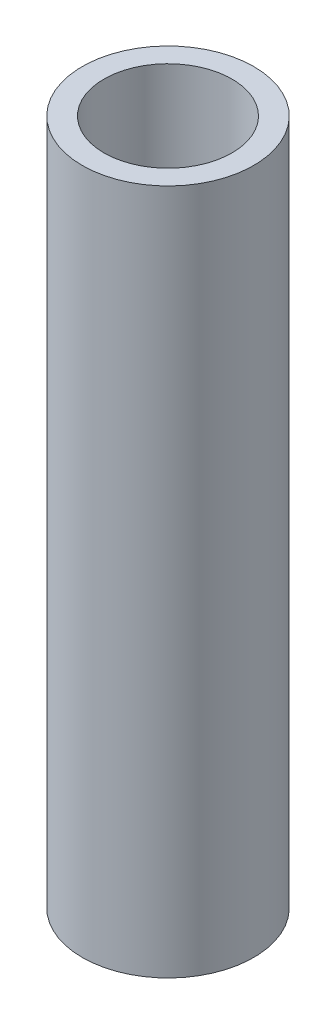
ISO-10303-21;
HEADER;
FILE_DESCRIPTION(('STEP AP214'),'2;1');
FILE_NAME('part.step','',(''),(''),'','','');
FILE_SCHEMA(('AUTOMOTIVE_DESIGN { 1 0 10303 214 1 1 1 1 }'));
ENDSEC;
DATA;
#1=APPLICATION_CONTEXT('core data for automotive mechanical design processes');
#2=APPLICATION_PROTOCOL_DEFINITION('international standard','automotive_design',2000,#1);
#3=PRODUCT_CONTEXT('',#1,'mechanical');
#4=PRODUCT('Part','Part','',(#3));
#5=PRODUCT_RELATED_PRODUCT_CATEGORY('part','',(#4));
#6=PRODUCT_DEFINITION_FORMATION('','',#4);
#7=PRODUCT_DEFINITION_CONTEXT('part definition',#1,'design');
#8=PRODUCT_DEFINITION('design','',#6,#7);
#9=PRODUCT_DEFINITION_SHAPE('','',#8);
#10=(LENGTH_UNIT() NAMED_UNIT(*) SI_UNIT(.MILLI.,.METRE.));
#11=(NAMED_UNIT(*) PLANE_ANGLE_UNIT() SI_UNIT($,.RADIAN.));
#12=(NAMED_UNIT(*) SI_UNIT($,.STERADIAN.) SOLID_ANGLE_UNIT());
#13=UNCERTAINTY_MEASURE_WITH_UNIT(LENGTH_MEASURE(1.E-05),#10,'distance_accuracy_value','');
#14=(GEOMETRIC_REPRESENTATION_CONTEXT(3) GLOBAL_UNCERTAINTY_ASSIGNED_CONTEXT((#13)) GLOBAL_UNIT_ASSIGNED_CONTEXT((#10,
#11,#12)) REPRESENTATION_CONTEXT('',''));
#15=CARTESIAN_POINT('',(0.,0.,0.));
#16=DIRECTION('',(0.,0.,1.));
#17=DIRECTION('',(1.,0.,0.));
#18=AXIS2_PLACEMENT_3D('',#15,#16,#17);
#19=CARTESIAN_POINT('',(0.,0.,0.));
#20=DIRECTION('',(0.,1.,0.));
#21=DIRECTION('',(0.,0.,1.));
#22=AXIS2_PLACEMENT_3D('',#19,#20,#21);
#23=CYLINDRICAL_SURFACE('',#22,7.112);
#24=CARTESIAN_POINT('',(0.,76.2,0.));
#25=DIRECTION('',(0.,1.,0.));
#26=DIRECTION('',(0.,0.,1.));
#27=AXIS2_PLACEMENT_3D('',#24,#25,#26);
#28=CIRCLE('',#27,7.112);
#29=CARTESIAN_POINT('',(0.,76.2,7.112));
#30=VERTEX_POINT('',#29);
#31=EDGE_CURVE('E26',#30,#30,#28,.F.);
#32=ORIENTED_EDGE('',*,*,#31,.F.);
#33=EDGE_LOOP('',(#32));
#34=FACE_BOUND('',#33,.T.);
#35=CARTESIAN_POINT('',(0.,0.,0.));
#36=DIRECTION('',(0.,1.,0.));
#37=DIRECTION('',(0.,0.,1.));
#38=AXIS2_PLACEMENT_3D('',#35,#36,#37);
#39=CIRCLE('',#38,7.112);
#40=CARTESIAN_POINT('',(0.,0.,7.112));
#41=VERTEX_POINT('',#40);
#42=EDGE_CURVE('E17',#41,#41,#39,.F.);
#43=ORIENTED_EDGE('',*,*,#42,.T.);
#44=EDGE_LOOP('',(#43));
#45=FACE_BOUND('',#44,.T.);
#46=ADVANCED_FACE('F14',(#34,#45),#23,.F.);
#47=CARTESIAN_POINT('',(0.,0.,0.));
#48=DIRECTION('',(0.,1.,0.));
#49=DIRECTION('',(0.,0.,1.));
#50=AXIS2_PLACEMENT_3D('',#47,#48,#49);
#51=PLANE('',#50);
#52=ORIENTED_EDGE('',*,*,#42,.F.);
#53=EDGE_LOOP('',(#52));
#54=FACE_BOUND('',#53,.T.);
#55=CARTESIAN_POINT('',(0.,0.,0.));
#56=DIRECTION('',(0.,1.,0.));
#57=DIRECTION('',(0.,0.,1.));
#58=AXIS2_PLACEMENT_3D('',#55,#56,#57);
#59=CIRCLE('',#58,9.525);
#60=CARTESIAN_POINT('',(0.,0.,9.525));
#61=VERTEX_POINT('',#60);
#62=EDGE_CURVE('E21',#61,#61,#59,.T.);
#63=ORIENTED_EDGE('',*,*,#62,.F.);
#64=EDGE_LOOP('',(#63));
#65=FACE_BOUND('',#64,.T.);
#66=ADVANCED_FACE('F35',(#54,#65),#51,.F.);
#67=CARTESIAN_POINT('',(0.,76.2,0.));
#68=DIRECTION('',(0.,1.,0.));
#69=DIRECTION('',(0.,0.,1.));
#70=AXIS2_PLACEMENT_3D('',#67,#68,#69);
#71=PLANE('',#70);
#72=ORIENTED_EDGE('',*,*,#31,.T.);
#73=EDGE_LOOP('',(#72));
#74=FACE_BOUND('',#73,.T.);
#75=CARTESIAN_POINT('',(0.,76.2,0.));
#76=DIRECTION('',(0.,1.,0.));
#77=DIRECTION('',(0.,0.,1.));
#78=AXIS2_PLACEMENT_3D('',#75,#76,#77);
#79=CIRCLE('',#78,9.525);
#80=CARTESIAN_POINT('',(0.,76.2,9.525));
#81=VERTEX_POINT('',#80);
#82=EDGE_CURVE('E10',#81,#81,#79,.F.);
#83=ORIENTED_EDGE('',*,*,#82,.F.);
#84=EDGE_LOOP('',(#83));
#85=FACE_BOUND('',#84,.T.);
#86=ADVANCED_FACE('F38',(#74,#85),#71,.T.);
#87=CARTESIAN_POINT('',(0.,0.,0.));
#88=DIRECTION('',(0.,1.,0.));
#89=DIRECTION('',(0.,0.,1.));
#90=AXIS2_PLACEMENT_3D('',#87,#88,#89);
#91=CYLINDRICAL_SURFACE('',#90,9.525);
#92=ORIENTED_EDGE('',*,*,#82,.T.);
#93=EDGE_LOOP('',(#92));
#94=FACE_BOUND('',#93,.T.);
#95=ORIENTED_EDGE('',*,*,#62,.T.);
#96=EDGE_LOOP('',(#95));
#97=FACE_BOUND('',#96,.T.);
#98=ADVANCED_FACE('F41',(#94,#97),#91,.T.);
#99=CLOSED_SHELL('',(#46,#66,#86,#98));
#100=MANIFOLD_SOLID_BREP('B1',#99);
#101=ADVANCED_BREP_SHAPE_REPRESENTATION('',(#18,#100),#14);
#102=SHAPE_DEFINITION_REPRESENTATION(#9,#101);
ENDSEC;
END-ISO-10303-21;
